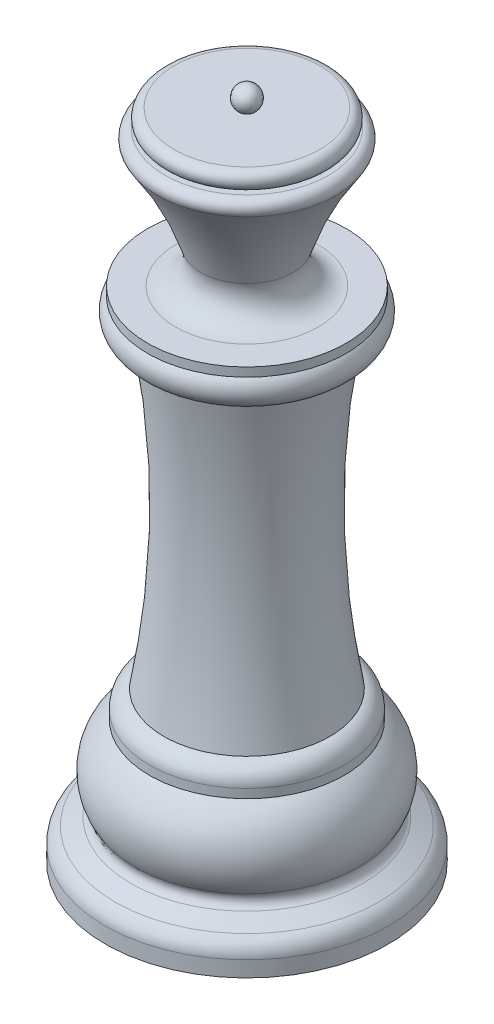
ISO-10303-21;
HEADER;
FILE_DESCRIPTION(('STEP AP214'),'2;1');
FILE_NAME('part.step','',(''),(''),'','','');
FILE_SCHEMA(('AUTOMOTIVE_DESIGN { 1 0 10303 214 1 1 1 1 }'));
ENDSEC;
DATA;
#1=APPLICATION_CONTEXT('core data for automotive mechanical design processes');
#2=APPLICATION_PROTOCOL_DEFINITION('international standard','automotive_design',2000,#1);
#3=PRODUCT_CONTEXT('',#1,'mechanical');
#4=PRODUCT('Part','Part','',(#3));
#5=PRODUCT_RELATED_PRODUCT_CATEGORY('part','',(#4));
#6=PRODUCT_DEFINITION_FORMATION('','',#4);
#7=PRODUCT_DEFINITION_CONTEXT('part definition',#1,'design');
#8=PRODUCT_DEFINITION('design','',#6,#7);
#9=PRODUCT_DEFINITION_SHAPE('','',#8);
#10=(LENGTH_UNIT() NAMED_UNIT(*) SI_UNIT(.MILLI.,.METRE.));
#11=(NAMED_UNIT(*) PLANE_ANGLE_UNIT() SI_UNIT($,.RADIAN.));
#12=(NAMED_UNIT(*) SI_UNIT($,.STERADIAN.) SOLID_ANGLE_UNIT());
#13=UNCERTAINTY_MEASURE_WITH_UNIT(LENGTH_MEASURE(1.E-05),#10,'distance_accuracy_value','');
#14=(GEOMETRIC_REPRESENTATION_CONTEXT(3) GLOBAL_UNCERTAINTY_ASSIGNED_CONTEXT((#13)) GLOBAL_UNIT_ASSIGNED_CONTEXT((#10,
#11,#12)) REPRESENTATION_CONTEXT('',''));
#15=CARTESIAN_POINT('',(0.,0.,0.));
#16=DIRECTION('',(0.,0.,1.));
#17=DIRECTION('',(1.,0.,0.));
#18=AXIS2_PLACEMENT_3D('',#15,#16,#17);
#19=CARTESIAN_POINT('',(-0.0189750148806921,64.6705116929669,0.));
#20=DIRECTION('',(0.,0.,-1.));
#21=DIRECTION('',(-1.,0.,0.));
#22=AXIS2_PLACEMENT_3D('',#19,#20,#21);
#23=CIRCLE('',#22,1.32772901443003);
#24=TRIMMED_CURVE('',#23,(PARAMETER_VALUE(-1.56899002664428)),
(PARAMETER_VALUE(1.56899002664428)),.T.,.PARAMETER.);
#25=CARTESIAN_POINT('',(-0.0213732906952779,64.6705116929669,0.));
#26=DIRECTION('',(0.,1.,0.));
#27=AXIS1_PLACEMENT('',#25,#26);
#28=SURFACE_OF_REVOLUTION('',#24,#27);
#29=CARTESIAN_POINT('',(-0.0213732906952777,63.7,0.));
#30=DIRECTION('',(0.,1.,0.));
#31=DIRECTION('',(-1.,0.,0.));
#32=AXIS2_PLACEMENT_3D('',#29,#30,#31);
#33=CIRCLE('',#32,0.90367643941253);
#34=CARTESIAN_POINT('',(-0.925049730107808,63.7,0.));
#35=VERTEX_POINT('',#34);
#36=EDGE_CURVE('E119',#35,#35,#33,.T.);
#37=ORIENTED_EDGE('',*,*,#36,.T.);
#38=EDGE_LOOP('',(#37));
#39=FACE_BOUND('',#38,.T.);
#40=CARTESIAN_POINT('',(-0.0213732906952781,65.9982385413933,0.));
#41=VERTEX_POINT('',#40);
#42=VERTEX_LOOP('',#41);
#43=FACE_BOUND('',#42,.T.);
#44=ADVANCED_FACE('F43',(#39,#43),#28,.T.);
#45=CARTESIAN_POINT('',(0.,-10.,0.));
#46=DIRECTION('',(0.,1.,0.));
#47=DIRECTION('',(-1.,0.,0.));
#48=AXIS2_PLACEMENT_3D('',#45,#46,#47);
#49=PLANE('',#48);
#50=CARTESIAN_POINT('',(-0.0213732906952661,-10.,0.));
#51=DIRECTION('',(0.,1.,0.));
#52=DIRECTION('',(-1.,0.,0.));
#53=AXIS2_PLACEMENT_3D('',#50,#51,#52);
#54=CIRCLE('',#53,15.9807853888944);
#55=CARTESIAN_POINT('',(-16.0021586795896,-10.,0.));
#56=VERTEX_POINT('',#55);
#57=EDGE_CURVE('E137',#56,#56,#54,.T.);
#58=ORIENTED_EDGE('',*,*,#57,.F.);
#59=EDGE_LOOP('',(#58));
#60=FACE_BOUND('',#59,.T.);
#61=ADVANCED_FACE('F54',(#60),#49,.F.);
#62=CARTESIAN_POINT('',(-0.0213732906952781,65.9982385413933,0.));
#63=DIRECTION('',(0.,1.,0.));
#64=DIRECTION('',(-1.,0.,0.));
#65=AXIS2_PLACEMENT_3D('',#62,#63,#64);
#66=CYLINDRICAL_SURFACE('',#65,15.9807853888944);
#67=CARTESIAN_POINT('',(-0.0213732906952663,-8.23154056282889,0.));
#68=DIRECTION('',(0.,-1.,0.));
#69=DIRECTION('',(1.,0.,0.));
#70=AXIS2_PLACEMENT_3D('',#67,#68,#69);
#71=CIRCLE('',#70,15.9807853888944);
#72=CARTESIAN_POINT('',(15.9594120981991,-8.23154056282889,0.));
#73=VERTEX_POINT('',#72);
#74=EDGE_CURVE('E143',#73,#73,#71,.T.);
#75=ORIENTED_EDGE('',*,*,#74,.T.);
#76=EDGE_LOOP('',(#75));
#77=FACE_BOUND('',#76,.T.);
#78=ORIENTED_EDGE('',*,*,#57,.T.);
#79=EDGE_LOOP('',(#78));
#80=FACE_BOUND('',#79,.T.);
#81=ADVANCED_FACE('F60',(#77,#80),#66,.T.);
#82=CARTESIAN_POINT('',(-0.0213732906952669,-5.,0.));
#83=DIRECTION('',(0.,-1.,0.));
#84=DIRECTION('',(1.,0.,0.));
#85=AXIS2_PLACEMENT_3D('',#82,#83,#84);
#86=CONICAL_SURFACE('',#85,12.0133656692873,1.10386933277747);
#87=CARTESIAN_POINT('',(-0.0213732906952671,-5.53659532978316,0.));
#88=DIRECTION('',(0.,-1.,0.));
#89=DIRECTION('',(1.,0.,0.));
#90=AXIS2_PLACEMENT_3D('',#87,#88,#89);
#91=CIRCLE('',#90,13.0778151157026);
#92=CARTESIAN_POINT('',(13.0564418250074,-5.53659532978316,0.));
#93=VERTEX_POINT('',#92);
#94=EDGE_CURVE('E91',#93,#93,#91,.T.);
#95=ORIENTED_EDGE('',*,*,#94,.T.);
#96=EDGE_LOOP('',(#95));
#97=FACE_BOUND('',#96,.T.);
#98=CARTESIAN_POINT('',(-0.0213732906952666,-6.44562896568912,0.));
#99=DIRECTION('',(0.,1.,0.));
#100=DIRECTION('',(-1.,0.,0.));
#101=AXIS2_PLACEMENT_3D('',#98,#99,#100);
#102=CIRCLE('',#101,14.8810741021423);
#103=CARTESIAN_POINT('',(-14.9024473928376,-6.44562896568912,0.));
#104=VERTEX_POINT('',#103);
#105=EDGE_CURVE('E140',#104,#104,#102,.T.);
#106=ORIENTED_EDGE('',*,*,#105,.T.);
#107=EDGE_LOOP('',(#106));
#108=FACE_BOUND('',#107,.T.);
#109=ADVANCED_FACE('F153',(#97,#108),#86,.T.);
#110=CARTESIAN_POINT('',(-0.0213732906952681,-0.966737581631369,0.));
#111=DIRECTION('',(0.,1.,0.));
#112=DIRECTION('',(-1.,0.,0.));
#113=AXIS2_PLACEMENT_3D('',#110,#111,#112);
#114=TOROIDAL_SURFACE('',#113,7.57284204896723,5.99878785739629);
#115=CARTESIAN_POINT('',(-0.0213732906952676,-4.11827685063193,0.));
#116=DIRECTION('',(0.,1.,0.));
#117=DIRECTION('',(-1.,0.,0.));
#118=AXIS2_PLACEMENT_3D('',#115,#116,#117);
#119=CIRCLE('',#118,12.6770810709952);
#120=CARTESIAN_POINT('',(-12.6984543616904,-4.11827685063193,0.));
#121=VERTEX_POINT('',#120);
#122=EDGE_CURVE('E95',#121,#121,#119,.T.);
#123=ORIENTED_EDGE('',*,*,#122,.T.);
#124=EDGE_LOOP('',(#123));
#125=FACE_BOUND('',#124,.T.);
#126=CARTESIAN_POINT('',(-0.0213732906952683,3.97,0.));
#127=DIRECTION('',(0.,1.,0.));
#128=DIRECTION('',(-1.,0.,0.));
#129=AXIS2_PLACEMENT_3D('',#126,#127,#128);
#130=CIRCLE('',#129,10.9807853888944);
#131=CARTESIAN_POINT('',(-11.0021586795896,3.97,0.));
#132=VERTEX_POINT('',#131);
#133=EDGE_CURVE('E134',#132,#132,#130,.T.);
#134=ORIENTED_EDGE('',*,*,#133,.F.);
#135=EDGE_LOOP('',(#134));
#136=FACE_BOUND('',#135,.T.);
#137=ADVANCED_FACE('F148',(#125,#136),#114,.T.);
#138=CARTESIAN_POINT('',(-0.0213732906952781,65.9982385413933,0.));
#139=DIRECTION('',(0.,1.,0.));
#140=DIRECTION('',(-1.,0.,0.));
#141=AXIS2_PLACEMENT_3D('',#138,#139,#140);
#142=CYLINDRICAL_SURFACE('',#141,10.9807853888944);
#143=CARTESIAN_POINT('',(-0.0213732906952684,4.97,0.));
#144=DIRECTION('',(0.,1.,0.));
#145=DIRECTION('',(-1.,0.,0.));
#146=AXIS2_PLACEMENT_3D('',#143,#144,#145);
#147=CIRCLE('',#146,10.9807853888944);
#148=CARTESIAN_POINT('',(-11.0021586795896,4.97,0.));
#149=VERTEX_POINT('',#148);
#150=EDGE_CURVE('E131',#149,#149,#147,.T.);
#151=ORIENTED_EDGE('',*,*,#150,.F.);
#152=EDGE_LOOP('',(#151));
#153=FACE_BOUND('',#152,.T.);
#154=ORIENTED_EDGE('',*,*,#133,.T.);
#155=EDGE_LOOP('',(#154));
#156=FACE_BOUND('',#155,.T.);
#157=ADVANCED_FACE('F152',(#153,#156),#142,.T.);
#158=CARTESIAN_POINT('',(-0.0213732906952681,5.00760679300477,0.));
#159=DIRECTION('',(0.,1.,0.));
#160=DIRECTION('',(-1.,0.,0.));
#161=AXIS2_PLACEMENT_3D('',#158,#159,#160);
#162=TOROIDAL_SURFACE('',#161,8.98113898787245,1.99999999999999);
#163=ORIENTED_EDGE('',*,*,#150,.T.);
#164=EDGE_LOOP('',(#163));
#165=FACE_BOUND('',#164,.T.);
#166=CARTESIAN_POINT('',(-0.0213732906952687,6.97,0.));
#167=DIRECTION('',(0.,1.,0.));
#168=DIRECTION('',(-1.,0.,0.));
#169=AXIS2_PLACEMENT_3D('',#166,#167,#168);
#170=CIRCLE('',#169,9.36716087991867);
#171=CARTESIAN_POINT('',(-9.38853417061394,6.97,0.));
#172=VERTEX_POINT('',#171);
#173=EDGE_CURVE('E128',#172,#172,#170,.T.);
#174=ORIENTED_EDGE('',*,*,#173,.F.);
#175=EDGE_LOOP('',(#174));
#176=FACE_BOUND('',#175,.T.);
#177=ADVANCED_FACE('F158',(#165,#176),#162,.T.);
#178=CARTESIAN_POINT('',(-0.0213732906952785,24.9298851659645,0.));
#179=DIRECTION('',(0.,1.,0.));
#180=DIRECTION('',(-1.,0.,0.));
#181=AXIS2_PLACEMENT_3D('',#178,#179,#180);
#182=TOROIDAL_SURFACE('',#181,107.741154012379,100.);
#183=CARTESIAN_POINT('',(-0.0213732906952743,41.97,0.));
#184=DIRECTION('',(0.,1.,0.));
#185=DIRECTION('',(-1.,0.,0.));
#186=AXIS2_PLACEMENT_3D('',#183,#184,#185);
#187=CIRCLE('',#186,9.20367643941253);
#188=CARTESIAN_POINT('',(-9.22504973010781,41.97,0.));
#189=VERTEX_POINT('',#188);
#190=EDGE_CURVE('E125',#189,#189,#187,.T.);
#191=ORIENTED_EDGE('',*,*,#190,.F.);
#192=EDGE_LOOP('',(#191));
#193=FACE_BOUND('',#192,.T.);
#194=ORIENTED_EDGE('',*,*,#173,.T.);
#195=EDGE_LOOP('',(#194));
#196=FACE_BOUND('',#195,.T.);
#197=ADVANCED_FACE('F165',(#193,#196),#182,.F.);
#198=CARTESIAN_POINT('',(-0.021373290695275,43.8851002801742,0.));
#199=DIRECTION('',(0.,1.,0.));
#200=DIRECTION('',(-1.,0.,0.));
#201=AXIS2_PLACEMENT_3D('',#198,#199,#200);
#202=TOROIDAL_SURFACE('',#201,9.78020997432341,2.00000000000001);
#203=ORIENTED_EDGE('',*,*,#190,.T.);
#204=EDGE_LOOP('',(#203));
#205=FACE_BOUND('',#204,.T.);
#206=CARTESIAN_POINT('',(-0.0213732906952748,45.29,0.));
#207=DIRECTION('',(0.,1.,0.));
#208=DIRECTION('',(-1.,0.,0.));
#209=AXIS2_PLACEMENT_3D('',#206,#207,#208);
#210=CIRCLE('',#209,11.2036764394125);
#211=CARTESIAN_POINT('',(-11.2250497301078,45.29,0.));
#212=VERTEX_POINT('',#211);
#213=EDGE_CURVE('E116',#212,#212,#210,.T.);
#214=ORIENTED_EDGE('',*,*,#213,.F.);
#215=EDGE_LOOP('',(#214));
#216=FACE_BOUND('',#215,.T.);
#217=ADVANCED_FACE('F274',(#205,#216),#202,.T.);
#218=CARTESIAN_POINT('',(-0.0213732906952781,65.9982385413933,0.));
#219=DIRECTION('',(0.,1.,0.));
#220=DIRECTION('',(-1.,0.,0.));
#221=AXIS2_PLACEMENT_3D('',#218,#219,#220);
#222=CYLINDRICAL_SURFACE('',#221,11.2036764394125);
#223=ORIENTED_EDGE('',*,*,#213,.T.);
#224=EDGE_LOOP('',(#223));
#225=FACE_BOUND('',#224,.T.);
#226=CARTESIAN_POINT('',(-0.021373290695275,46.29,0.));
#227=DIRECTION('',(0.,1.,0.));
#228=DIRECTION('',(-1.,0.,0.));
#229=AXIS2_PLACEMENT_3D('',#226,#227,#228);
#230=CIRCLE('',#229,11.2036764394125);
#231=CARTESIAN_POINT('',(-11.2250497301078,46.29,0.));
#232=VERTEX_POINT('',#231);
#233=EDGE_CURVE('E112',#232,#232,#230,.T.);
#234=ORIENTED_EDGE('',*,*,#233,.F.);
#235=EDGE_LOOP('',(#234));
#236=FACE_BOUND('',#235,.T.);
#237=ADVANCED_FACE('F217',(#225,#236),#222,.T.);
#238=CARTESIAN_POINT('',(0.,46.29,0.));
#239=DIRECTION('',(0.,-1.,0.));
#240=DIRECTION('',(1.,0.,0.));
#241=AXIS2_PLACEMENT_3D('',#238,#239,#240);
#242=PLANE('',#241);
#243=CARTESIAN_POINT('',(-0.0213732906952726,46.29,0.));
#244=DIRECTION('',(0.,-1.,0.));
#245=DIRECTION('',(1.,0.,0.));
#246=AXIS2_PLACEMENT_3D('',#243,#244,#245);
#247=CIRCLE('',#246,8.04548860077382);
#248=CARTESIAN_POINT('',(8.02411531007855,46.29,0.));
#249=VERTEX_POINT('',#248);
#250=EDGE_CURVE('E86',#249,#249,#247,.T.);
#251=ORIENTED_EDGE('',*,*,#250,.T.);
#252=EDGE_LOOP('',(#251));
#253=FACE_BOUND('',#252,.T.);
#254=ORIENTED_EDGE('',*,*,#233,.T.);
#255=EDGE_LOOP('',(#254));
#256=FACE_BOUND('',#255,.T.);
#257=ADVANCED_FACE('F214',(#253,#256),#242,.F.);
#258=CARTESIAN_POINT('',(-0.0213732906952716,39.4227636483468,0.));
#259=DIRECTION('',(0.,1.,0.));
#260=DIRECTION('',(-1.,0.,0.));
#261=AXIS2_PLACEMENT_3D('',#258,#259,#260);
#262=TOROIDAL_SURFACE('',#261,39.783413893552,36.2363995509344);
#263=CARTESIAN_POINT('',(-0.0213732906952748,60.1285903951979,0.));
#264=DIRECTION('',(0.,-1.,0.));
#265=DIRECTION('',(1.,0.,0.));
#266=AXIS2_PLACEMENT_3D('',#263,#264,#265);
#267=CIRCLE('',#266,10.0454685855058);
#268=CARTESIAN_POINT('',(10.0240952948105,60.1285903951979,0.));
#269=VERTEX_POINT('',#268);
#270=EDGE_CURVE('E11',#269,#269,#267,.T.);
#271=ORIENTED_EDGE('',*,*,#270,.T.);
#272=EDGE_LOOP('',(#271));
#273=FACE_BOUND('',#272,.T.);
#274=CARTESIAN_POINT('',(-0.0213732906952733,50.1806412684562,0.));
#275=DIRECTION('',(0.,-1.,0.));
#276=DIRECTION('',(1.,0.,0.));
#277=AXIS2_PLACEMENT_3D('',#274,#275,#276);
#278=CIRCLE('',#277,5.18074461030577);
#279=CARTESIAN_POINT('',(5.1593713196105,50.1806412684562,0.));
#280=VERTEX_POINT('',#279);
#281=EDGE_CURVE('E89',#280,#280,#278,.F.);
#282=ORIENTED_EDGE('',*,*,#281,.T.);
#283=EDGE_LOOP('',(#282));
#284=FACE_BOUND('',#283,.T.);
#285=ADVANCED_FACE('F106',(#273,#284),#262,.F.);
#286=CARTESIAN_POINT('',(0.,61.7,0.));
#287=DIRECTION('',(0.,-1.,0.));
#288=DIRECTION('',(1.,0.,0.));
#289=AXIS2_PLACEMENT_3D('',#286,#287,#288);
#290=PLANE('',#289);
#291=CARTESIAN_POINT('',(-0.0213732906952751,61.7,0.));
#292=DIRECTION('',(0.,-1.,0.));
#293=DIRECTION('',(1.,0.,0.));
#294=AXIS2_PLACEMENT_3D('',#291,#292,#293);
#295=CIRCLE('',#294,9.22480357251944);
#296=CARTESIAN_POINT('',(9.20343028182417,61.7,0.));
#297=VERTEX_POINT('',#296);
#298=EDGE_CURVE('E50',#297,#297,#295,.F.);
#299=ORIENTED_EDGE('',*,*,#298,.T.);
#300=EDGE_LOOP('',(#299));
#301=FACE_BOUND('',#300,.T.);
#302=CARTESIAN_POINT('',(-0.0213732906952774,61.7,0.));
#303=DIRECTION('',(0.,1.,0.));
#304=DIRECTION('',(-1.,0.,0.));
#305=AXIS2_PLACEMENT_3D('',#302,#303,#304);
#306=CIRCLE('',#305,8.20367643941253);
#307=CARTESIAN_POINT('',(-8.22504973010781,61.7,0.));
#308=VERTEX_POINT('',#307);
#309=EDGE_CURVE('E110',#308,#308,#306,.T.);
#310=ORIENTED_EDGE('',*,*,#309,.F.);
#311=EDGE_LOOP('',(#310));
#312=FACE_BOUND('',#311,.T.);
#313=ADVANCED_FACE('F101',(#301,#312),#290,.F.);
#314=CARTESIAN_POINT('',(-0.0213732906952785,62.7,0.));
#315=DIRECTION('',(0.,1.,0.));
#316=DIRECTION('',(-1.,0.,0.));
#317=AXIS2_PLACEMENT_3D('',#314,#315,#316);
#318=TOROIDAL_SURFACE('',#317,8.20367643941253,0.999999999999994);
#319=CARTESIAN_POINT('',(-0.0213732906952777,63.7,0.));
#320=DIRECTION('',(0.,1.,0.));
#321=DIRECTION('',(-1.,0.,0.));
#322=AXIS2_PLACEMENT_3D('',#319,#320,#321);
#323=CIRCLE('',#322,8.20367643941253);
#324=CARTESIAN_POINT('',(-8.22504973010781,63.7,0.));
#325=VERTEX_POINT('',#324);
#326=EDGE_CURVE('E113',#325,#325,#323,.T.);
#327=ORIENTED_EDGE('',*,*,#326,.F.);
#328=EDGE_LOOP('',(#327));
#329=FACE_BOUND('',#328,.T.);
#330=ORIENTED_EDGE('',*,*,#309,.T.);
#331=EDGE_LOOP('',(#330));
#332=FACE_BOUND('',#331,.T.);
#333=ADVANCED_FACE('F105',(#329,#332),#318,.T.);
#334=CARTESIAN_POINT('',(0.,63.7,0.));
#335=DIRECTION('',(0.,-1.,0.));
#336=DIRECTION('',(1.,0.,0.));
#337=AXIS2_PLACEMENT_3D('',#334,#335,#336);
#338=PLANE('',#337);
#339=ORIENTED_EDGE('',*,*,#36,.F.);
#340=EDGE_LOOP('',(#339));
#341=FACE_BOUND('',#340,.T.);
#342=ORIENTED_EDGE('',*,*,#326,.T.);
#343=EDGE_LOOP('',(#342));
#344=FACE_BOUND('',#343,.T.);
#345=ADVANCED_FACE('F70',(#341,#344),#338,.F.);
#346=CARTESIAN_POINT('',(-0.0213732906952663,-8.23154056282889,0.));
#347=DIRECTION('',(0.,-1.,0.));
#348=DIRECTION('',(1.,0.,0.));
#349=AXIS2_PLACEMENT_3D('',#346,#347,#348);
#350=TOROIDAL_SURFACE('',#349,13.9807853888944,2.);
#351=ORIENTED_EDGE('',*,*,#74,.F.);
#352=EDGE_LOOP('',(#351));
#353=FACE_BOUND('',#352,.T.);
#354=ORIENTED_EDGE('',*,*,#105,.F.);
#355=EDGE_LOOP('',(#354));
#356=FACE_BOUND('',#355,.T.);
#357=ADVANCED_FACE('F66',(#353,#356),#350,.T.);
#358=CARTESIAN_POINT('',(-0.0213732906952672,-4.64363953121327,0.));
#359=DIRECTION('',(0.,1.,0.));
#360=DIRECTION('',(-1.,0.,0.));
#361=AXIS2_PLACEMENT_3D('',#358,#359,#360);
#362=TOROIDAL_SURFACE('',#361,13.5279594723266,1.);
#363=ORIENTED_EDGE('',*,*,#94,.F.);
#364=EDGE_LOOP('',(#363));
#365=FACE_BOUND('',#364,.T.);
#366=ORIENTED_EDGE('',*,*,#122,.F.);
#367=EDGE_LOOP('',(#366));
#368=FACE_BOUND('',#367,.T.);
#369=ADVANCED_FACE('F69',(#365,#368),#362,.F.);
#370=CARTESIAN_POINT('',(-0.0213732906952731,49.29,0.));
#371=DIRECTION('',(0.,1.,0.));
#372=DIRECTION('',(-1.,0.,0.));
#373=AXIS2_PLACEMENT_3D('',#370,#371,#372);
#374=TOROIDAL_SURFACE('',#373,8.04548860077382,3.);
#375=ORIENTED_EDGE('',*,*,#250,.F.);
#376=EDGE_LOOP('',(#375));
#377=FACE_BOUND('',#376,.T.);
#378=ORIENTED_EDGE('',*,*,#281,.F.);
#379=EDGE_LOOP('',(#378));
#380=FACE_BOUND('',#379,.T.);
#381=ADVANCED_FACE('F73',(#377,#380),#374,.F.);
#382=CARTESIAN_POINT('',(-0.0213732906952749,60.7,0.));
#383=DIRECTION('',(0.,1.,0.));
#384=DIRECTION('',(-1.,0.,0.));
#385=AXIS2_PLACEMENT_3D('',#382,#383,#384);
#386=TOROIDAL_SURFACE('',#385,9.22480357251944,1.);
#387=ORIENTED_EDGE('',*,*,#270,.F.);
#388=EDGE_LOOP('',(#387));
#389=FACE_BOUND('',#388,.T.);
#390=ORIENTED_EDGE('',*,*,#298,.F.);
#391=EDGE_LOOP('',(#390));
#392=FACE_BOUND('',#391,.T.);
#393=ADVANCED_FACE('F45',(#389,#392),#386,.T.);
#394=CLOSED_SHELL('',(#44,#61,#81,#109,#137,#157,#177,#197,#217,#237,#257,#285,#313,#333,#345,
#357,#369,#381,#393));
#395=MANIFOLD_SOLID_BREP('B2',#394);
#396=ADVANCED_BREP_SHAPE_REPRESENTATION('',(#18,#395),#14);
#397=SHAPE_DEFINITION_REPRESENTATION(#9,#396);
ENDSEC;
END-ISO-10303-21;
